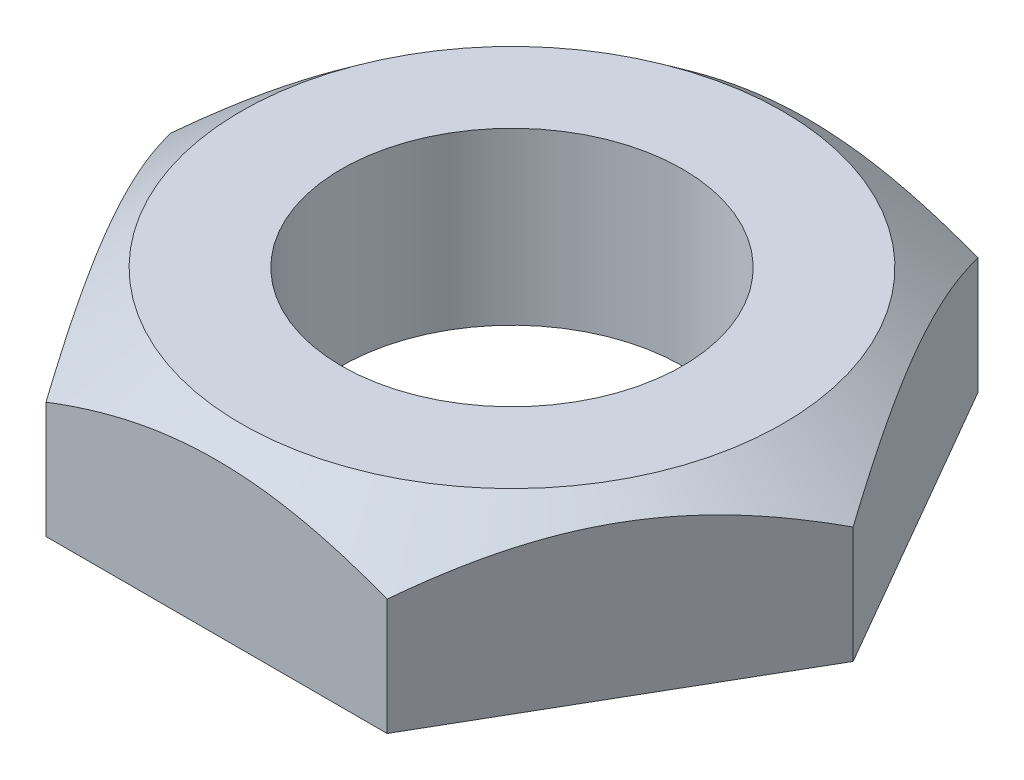
ISO-10303-21;
HEADER;
FILE_DESCRIPTION(('STEP AP214'),'2;1');
FILE_NAME('part.step','',(''),(''),'','','');
FILE_SCHEMA(('AUTOMOTIVE_DESIGN { 1 0 10303 214 1 1 1 1 }'));
ENDSEC;
DATA;
#1=APPLICATION_CONTEXT('core data for automotive mechanical design processes');
#2=APPLICATION_PROTOCOL_DEFINITION('international standard','automotive_design',2000,#1);
#3=PRODUCT_CONTEXT('',#1,'mechanical');
#4=PRODUCT('Part','Part','',(#3));
#5=PRODUCT_RELATED_PRODUCT_CATEGORY('part','',(#4));
#6=PRODUCT_DEFINITION_FORMATION('','',#4);
#7=PRODUCT_DEFINITION_CONTEXT('part definition',#1,'design');
#8=PRODUCT_DEFINITION('design','',#6,#7);
#9=PRODUCT_DEFINITION_SHAPE('','',#8);
#10=(LENGTH_UNIT() NAMED_UNIT(*) SI_UNIT(.MILLI.,.METRE.));
#11=(NAMED_UNIT(*) PLANE_ANGLE_UNIT() SI_UNIT($,.RADIAN.));
#12=(NAMED_UNIT(*) SI_UNIT($,.STERADIAN.) SOLID_ANGLE_UNIT());
#13=UNCERTAINTY_MEASURE_WITH_UNIT(LENGTH_MEASURE(1.E-05),#10,'distance_accuracy_value','');
#14=(GEOMETRIC_REPRESENTATION_CONTEXT(3) GLOBAL_UNCERTAINTY_ASSIGNED_CONTEXT((#13)) GLOBAL_UNIT_ASSIGNED_CONTEXT((#10,
#11,#12)) REPRESENTATION_CONTEXT('',''));
#15=CARTESIAN_POINT('',(0.,0.,0.));
#16=DIRECTION('',(0.,0.,1.));
#17=DIRECTION('',(1.,0.,0.));
#18=AXIS2_PLACEMENT_3D('',#15,#16,#17);
#19=CARTESIAN_POINT('',(0.,15.,0.));
#20=DIRECTION('',(0.,1.,0.));
#21=DIRECTION('',(0.,0.,1.));
#22=AXIS2_PLACEMENT_3D('',#19,#20,#21);
#23=PLANE('',#22);
#24=CARTESIAN_POINT('',(0.,15.,0.));
#25=DIRECTION('',(0.,1.,0.));
#26=DIRECTION('',(0.,0.,1.));
#27=AXIS2_PLACEMENT_3D('',#24,#25,#26);
#28=CIRCLE('',#27,15.);
#29=CARTESIAN_POINT('',(0.,15.,15.));
#30=VERTEX_POINT('',#29);
#31=EDGE_CURVE('E161',#30,#30,#28,.T.);
#32=ORIENTED_EDGE('',*,*,#31,.F.);
#33=EDGE_LOOP('',(#32));
#34=FACE_BOUND('',#33,.T.);
#35=CARTESIAN_POINT('',(0.,15.,0.));
#36=DIRECTION('',(0.,-1.,0.));
#37=DIRECTION('',(0.,0.,-1.));
#38=AXIS2_PLACEMENT_3D('',#35,#36,#37);
#39=CIRCLE('',#38,23.8137384173545);
#40=CARTESIAN_POINT('',(0.,15.,-23.8137384173545));
#41=VERTEX_POINT('',#40);
#42=EDGE_CURVE('E241',#41,#41,#39,.T.);
#43=ORIENTED_EDGE('',*,*,#42,.F.);
#44=EDGE_LOOP('',(#43));
#45=FACE_BOUND('',#44,.T.);
#46=ADVANCED_FACE('F43',(#34,#45),#23,.T.);
#47=CARTESIAN_POINT('',(15.,15.,25.9807621135332));
#48=DIRECTION('',(-0.866025403784439,0.,-0.5));
#49=DIRECTION('',(-0.5,0.,0.866025403784439));
#50=AXIS2_PLACEMENT_3D('',#47,#48,#49);
#51=PLANE('',#50);
#52=CARTESIAN_POINT('',(14.9998845299462,10.2357936435378,25.9809621135332));
#53=CARTESIAN_POINT('',(15.2704859501592,10.4441675611058,25.5122667051238));
#54=CARTESIAN_POINT('',(15.5425280106104,10.6452361831974,25.0410760346268));
#55=CARTESIAN_POINT('',(16.0896323623025,11.0307842811541,24.0934635004539));
#56=CARTESIAN_POINT('',(16.3646956335806,11.2152581842225,23.6170399393041));
#57=CARTESIAN_POINT('',(16.9186460391594,11.5660316287694,22.6575696919683));
#58=CARTESIAN_POINT('',(17.1975422945631,11.7322738684479,22.1745072075684));
#59=CARTESIAN_POINT('',(17.7582460420058,12.0436841397442,21.2033398290034));
#60=CARTESIAN_POINT('',(18.0400532637849,12.1888541092468,20.715235402942));
#61=CARTESIAN_POINT('',(18.6037577371206,12.4546128748615,19.7388706146709));
#62=CARTESIAN_POINT('',(18.8856290360655,12.5754207397537,19.2506552037028));
#63=CARTESIAN_POINT('',(19.4517815987411,12.7920290161786,18.2700502003134));
#64=CARTESIAN_POINT('',(19.7360628953027,12.8878290864671,17.7776605510271));
#65=CARTESIAN_POINT('',(20.3062406784641,13.0524262677183,16.7900836612446));
#66=CARTESIAN_POINT('',(20.5921348451967,13.1212553206842,16.2949004388762));
#67=CARTESIAN_POINT('',(21.1652803085985,13.2305820688845,15.3021833761367));
#68=CARTESIAN_POINT('',(21.452531592742,13.271080025093,14.8046495574608));
#69=CARTESIAN_POINT('',(22.0319119824329,13.3231899697229,13.8011332856071));
#70=CARTESIAN_POINT('',(22.3240508921791,13.3343700419419,13.2951338510587));
#71=CARTESIAN_POINT('',(22.9082246706125,13.3263266528391,12.2833151863627));
#72=CARTESIAN_POINT('',(23.2002595386214,13.3071029968625,11.7774959573895));
#73=CARTESIAN_POINT('',(23.7835965426133,13.2387022750776,10.7671266285407));
#74=CARTESIAN_POINT('',(24.0748982219566,13.1895097354574,10.2625773195878));
#75=CARTESIAN_POINT('',(24.655913525629,13.0623106726729,9.25622929365224));
#76=CARTESIAN_POINT('',(24.9456271447436,12.9843040549549,8.75443058570105));
#77=CARTESIAN_POINT('',(25.5228401677539,12.8011899799362,7.75466830305673));
#78=CARTESIAN_POINT('',(25.8103399754169,12.6960875911595,7.25670402901815));
#79=CARTESIAN_POINT('',(26.3827433164498,12.4608511332335,6.26527235992711));
#80=CARTESIAN_POINT('',(26.6676467950265,12.3307165370788,5.77180505977899));
#81=CARTESIAN_POINT('',(27.5178825828808,11.9062232977044,4.29915347680212));
#82=CARTESIAN_POINT('',(28.0790162169955,11.5776836401266,3.32724151267965));
#83=CARTESIAN_POINT('',(28.8639577073434,11.0614786349708,1.96768297042831));
#84=CARTESIAN_POINT('',(29.0929270530625,10.9039431879406,1.57109643026695));
#85=CARTESIAN_POINT('',(29.5482857071618,10.5778854751727,0.782392105700877));
#86=CARTESIAN_POINT('',(29.7746798805903,10.4093904204214,0.390265894785079));
#87=CARTESIAN_POINT('',(30.0001154700538,10.2357936435378,-0.000200000000009223));
#88=B_SPLINE_CURVE_WITH_KNOTS('',3,(#52,#53,#54,#55,#56,#57,#58,#59,#60,#61,#62,#63,#64,#65,#66,
#67,#68,#69,#70,#71,#72,#73,#74,#75,#76,#77,#78,#79,#80,#81,#82,#83,#84,#85,#86,#87),
.UNSPECIFIED.,.F.,.F.,(4,2,2,2,2,2,2,2,2,2,2,2,2,2,2,2,2,4),(0.,1.73983580816927,
3.4802537193459,5.22599378518515,6.97157320437406,8.70067762095474,10.429805630816,
12.1568795854982,13.8839376308947,15.6362996610812,17.388672910515,19.1419517293121,
20.8952363015643,22.6481931427846,24.4011868932106,27.9055010349313,29.35825415591,
30.8075286844148),.UNSPECIFIED.);
#89=CARTESIAN_POINT('',(15.,10.2358825689841,25.9807621135332));
#90=VERTEX_POINT('',#89);
#91=CARTESIAN_POINT('',(30.,10.2358825689841,0.));
#92=VERTEX_POINT('',#91);
#93=EDGE_CURVE('E108',#90,#92,#88,.T.);
#94=ORIENTED_EDGE('',*,*,#93,.F.);
#95=DIRECTION('',(0.,-1.,0.));
#96=VECTOR('',#95,1.);
#97=CARTESIAN_POINT('',(15.,15.,25.9807621135332));
#98=LINE('',#97,#96);
#99=CARTESIAN_POINT('',(15.,0.,25.9807621135332));
#100=VERTEX_POINT('',#99);
#101=EDGE_CURVE('E73',#90,#100,#98,.T.);
#102=ORIENTED_EDGE('',*,*,#101,.T.);
#103=DIRECTION('',(0.5,0.,-0.866025403784439));
#104=VECTOR('',#103,1.);
#105=CARTESIAN_POINT('',(15.,0.,25.9807621135332));
#106=LINE('',#105,#104);
#107=CARTESIAN_POINT('',(30.,0.,0.));
#108=VERTEX_POINT('',#107);
#109=EDGE_CURVE('E158',#100,#108,#106,.T.);
#110=ORIENTED_EDGE('',*,*,#109,.T.);
#111=DIRECTION('',(0.,-1.,0.));
#112=VECTOR('',#111,1.);
#113=CARTESIAN_POINT('',(30.,15.,0.));
#114=LINE('',#113,#112);
#115=EDGE_CURVE('E59',#92,#108,#114,.T.);
#116=ORIENTED_EDGE('',*,*,#115,.F.);
#117=EDGE_LOOP('',(#94,#102,#110,#116));
#118=FACE_BOUND('',#117,.T.);
#119=ADVANCED_FACE('F45',(#118),#51,.F.);
#120=CARTESIAN_POINT('',(30.,15.,0.));
#121=DIRECTION('',(-0.866025403784439,0.,0.5));
#122=DIRECTION('',(0.5,0.,0.866025403784439));
#123=AXIS2_PLACEMENT_3D('',#120,#121,#122);
#124=PLANE('',#123);
#125=CARTESIAN_POINT('',(30.0001154700538,10.2357936435378,0.000199999999996184));
#126=CARTESIAN_POINT('',(29.7295140498408,10.4441675611059,-0.468495408409326));
#127=CARTESIAN_POINT('',(29.4574719893896,10.6452361831974,-0.939686078906406));
#128=CARTESIAN_POINT('',(28.9103676376975,11.0307842811541,-1.88729861307931));
#129=CARTESIAN_POINT('',(28.6353043664193,11.2152581842225,-2.36372217422908));
#130=CARTESIAN_POINT('',(28.0813539608406,11.5660316287694,-3.32319242156484));
#131=CARTESIAN_POINT('',(27.8024577054369,11.732273868448,-3.80625490596474));
#132=CARTESIAN_POINT('',(27.2417539579942,12.0436841397442,-4.77742228452974));
#133=CARTESIAN_POINT('',(26.959946736215,12.1888541092468,-5.26552671059114));
#134=CARTESIAN_POINT('',(26.3962422628794,12.4546128748615,-6.2418914988623));
#135=CARTESIAN_POINT('',(26.1143709639345,12.5754207397538,-6.73010690983039));
#136=CARTESIAN_POINT('',(25.5482184012589,12.7920290161787,-7.71071191321978));
#137=CARTESIAN_POINT('',(25.2639371046973,12.8878290864671,-8.20310156250604));
#138=CARTESIAN_POINT('',(24.6937593215359,13.0524262677183,-9.19067845228858));
#139=CARTESIAN_POINT('',(24.4078651548033,13.1212553206842,-9.68586167465696));
#140=CARTESIAN_POINT('',(23.8347196914015,13.2305820688845,-10.6785787373965));
#141=CARTESIAN_POINT('',(23.547468407258,13.271080025093,-11.1761125560724));
#142=CARTESIAN_POINT('',(22.9680880175671,13.3231899697229,-12.1796288279261));
#143=CARTESIAN_POINT('',(22.6759491078209,13.334370041942,-12.6856282624744));
#144=CARTESIAN_POINT('',(22.0917753293875,13.3263266528391,-13.6974469271705));
#145=CARTESIAN_POINT('',(21.7997404613785,13.3071029968625,-14.2032661561437));
#146=CARTESIAN_POINT('',(21.2164034573867,13.2387022750776,-15.2136354849925));
#147=CARTESIAN_POINT('',(20.9251017780434,13.1895097354574,-15.7181847939453));
#148=CARTESIAN_POINT('',(20.344086474371,13.0623106726729,-16.7245328198809));
#149=CARTESIAN_POINT('',(20.0543728552564,12.9843040549549,-17.2263315278321));
#150=CARTESIAN_POINT('',(19.477159832246,12.8011899799362,-18.2260938104764));
#151=CARTESIAN_POINT('',(19.1896600245831,12.6960875911595,-18.724058084515));
#152=CARTESIAN_POINT('',(18.6172566835502,12.4608511332335,-19.7154897536061));
#153=CARTESIAN_POINT('',(18.3323532049734,12.3307165370788,-20.2089570537542));
#154=CARTESIAN_POINT('',(17.4821174171192,11.9062232977044,-21.681608636731));
#155=CARTESIAN_POINT('',(16.9209837830045,11.5776836401266,-22.6535206008535));
#156=CARTESIAN_POINT('',(16.1360422926566,11.0614786349708,-24.0130791431049));
#157=CARTESIAN_POINT('',(15.9070729469375,10.9039431879406,-24.4096656832662));
#158=CARTESIAN_POINT('',(15.4517142928382,10.5778854751727,-25.1983700078323));
#159=CARTESIAN_POINT('',(15.2253201194097,10.4093904204214,-25.5904962187481));
#160=CARTESIAN_POINT('',(14.9998845299461,10.2357936435378,-25.9809621135332));
#161=B_SPLINE_CURVE_WITH_KNOTS('',3,(#125,#126,#127,#128,#129,#130,#131,#132,#133,#134,#135,
#136,#137,#138,#139,#140,#141,#142,#143,#144,#145,#146,#147,#148,#149,#150,#151,#152,#153,#154,
#155,#156,#157,#158,#159,#160),.UNSPECIFIED.,.F.,.F.,(4,2,2,2,2,2,2,2,2,2,2,2,2,2,2,2,2,4),(0.,
1.73983580816927,3.4802537193459,5.22599378518515,6.97157320437407,8.70067762095475,
10.429805630816,12.1568795854982,13.8839376308947,15.6362996610812,17.388672910515,
19.1419517293121,20.8952363015643,22.6481931427846,24.4011868932106,27.9055010349313,
29.35825415591,30.8075286844148),.UNSPECIFIED.);
#162=CARTESIAN_POINT('',(15.,10.2358825689841,-25.9807621135332));
#163=VERTEX_POINT('',#162);
#164=EDGE_CURVE('E103',#92,#163,#161,.T.);
#165=ORIENTED_EDGE('',*,*,#164,.F.);
#166=ORIENTED_EDGE('',*,*,#115,.T.);
#167=DIRECTION('',(-0.5,0.,-0.866025403784439));
#168=VECTOR('',#167,1.);
#169=CARTESIAN_POINT('',(30.,0.,0.));
#170=LINE('',#169,#168);
#171=CARTESIAN_POINT('',(15.,0.,-25.9807621135332));
#172=VERTEX_POINT('',#171);
#173=EDGE_CURVE('E126',#108,#172,#170,.T.);
#174=ORIENTED_EDGE('',*,*,#173,.T.);
#175=DIRECTION('',(0.,-1.,0.));
#176=VECTOR('',#175,1.);
#177=CARTESIAN_POINT('',(15.,15.,-25.9807621135332));
#178=LINE('',#177,#176);
#179=EDGE_CURVE('E118',#163,#172,#178,.T.);
#180=ORIENTED_EDGE('',*,*,#179,.F.);
#181=EDGE_LOOP('',(#165,#166,#174,#180));
#182=FACE_BOUND('',#181,.T.);
#183=ADVANCED_FACE('F124',(#182),#124,.F.);
#184=CARTESIAN_POINT('',(15.,15.,-25.9807621135332));
#185=DIRECTION('',(0.,0.,1.));
#186=DIRECTION('',(1.,0.,0.));
#187=AXIS2_PLACEMENT_3D('',#184,#185,#186);
#188=PLANE('',#187);
#189=CARTESIAN_POINT('',(45.376124922486,-6.92807404338308,-25.9807621135332));
#190=CARTESIAN_POINT('',(44.5449377185835,-6.37261734748064,-25.9807621135332));
#191=CARTESIAN_POINT('',(43.7120388931108,-5.81970710763573,-25.9807621135332));
#192=CARTESIAN_POINT('',(42.0422445945186,-4.71989951347316,-25.9807621135332));
#193=CARTESIAN_POINT('',(41.2053489959251,-4.17300234973302,-25.9807621135332));
#194=CARTESIAN_POINT('',(39.5263788348697,-3.08574781745709,-25.9807621135332));
#195=CARTESIAN_POINT('',(38.684300710475,-2.54539594297445,-25.9807621135332));
#196=CARTESIAN_POINT('',(36.9949532335773,-1.47287592031365,-25.9807621135332));
#197=CARTESIAN_POINT('',(36.1476839233394,-0.940707705630053,-25.9807621135332));
#198=CARTESIAN_POINT('',(34.4222449850435,0.129440771681268,-25.9807621135332));
#199=CARTESIAN_POINT('',(33.5438973535747,0.66713446125507,-25.9807621135332));
#200=CARTESIAN_POINT('',(31.7798263007849,1.73033009285057,-25.9807621135332));
#201=CARTESIAN_POINT('',(30.8941027934177,2.25583189237116,-25.9807621135332));
#202=CARTESIAN_POINT('',(29.1143223661898,3.29199351072169,-25.9807621135332));
#203=CARTESIAN_POINT('',(28.2202677808193,3.80265733144407,-25.9807621135332));
#204=CARTESIAN_POINT('',(26.4221809328339,4.80612116331534,-25.9807621135332));
#205=CARTESIAN_POINT('',(25.5181489256437,5.29892163039364,-25.9807621135332));
#206=CARTESIAN_POINT('',(23.9245504921419,6.14285697259477,-25.9807621135332));
#207=CARTESIAN_POINT('',(23.2375139544625,6.49876483624686,-25.9807621135332));
#208=CARTESIAN_POINT('',(21.856084784585,7.1960513708593,-25.9807621135332));
#209=CARTESIAN_POINT('',(21.1616921450369,7.53743002730072,-25.9807621135332));
#210=CARTESIAN_POINT('',(19.7644655669596,8.20321997542664,-25.9807621135332));
#211=CARTESIAN_POINT('',(19.0616284734025,8.52762466652126,-25.9807621135332));
#212=CARTESIAN_POINT('',(17.6469504778696,9.15624016996916,-25.9807621135332));
#213=CARTESIAN_POINT('',(16.9351096353771,9.46045111564957,-25.9807621135332));
#214=CARTESIAN_POINT('',(15.5084234427492,10.0422595376663,-25.9807621135332));
#215=CARTESIAN_POINT('',(14.7936699306249,10.3200811875424,-25.9807621135332));
#216=CARTESIAN_POINT('',(13.3539666960497,10.8481769076638,-25.9807621135332));
#217=CARTESIAN_POINT('',(12.6290166009468,11.0984499681319,-25.9807621135332));
#218=CARTESIAN_POINT('',(11.1691952147574,11.5665701215559,-25.9807621135332));
#219=CARTESIAN_POINT('',(10.4343309024642,11.7844388457154,-25.9807621135332));
#220=CARTESIAN_POINT('',(8.9545472435966,12.1828247970844,-25.9807621135332));
#221=CARTESIAN_POINT('',(8.20962944534514,12.3633477074957,-25.9807621135332));
#222=CARTESIAN_POINT('',(6.94413383956382,12.6323253280947,-25.9807621135332));
#223=CARTESIAN_POINT('',(6.42591800398296,12.7319458981922,-25.9807621135332));
#224=CARTESIAN_POINT('',(5.38579669746268,12.9094961028935,-25.9807621135332));
#225=CARTESIAN_POINT('',(4.86389152265968,12.9874274586259,-25.9807621135332));
#226=CARTESIAN_POINT('',(3.8172237783469,13.1202502447026,-25.9807621135332));
#227=CARTESIAN_POINT('',(3.29246164779128,13.175145118606,-25.9807621135332));
#228=CARTESIAN_POINT('',(2.24096109113732,13.2608927658515,-25.9807621135332));
#229=CARTESIAN_POINT('',(1.71422265141634,13.2917453731639,-25.9807621135332));
#230=CARTESIAN_POINT('',(0.66077061829569,13.3287732149059,-25.9807621135332));
#231=CARTESIAN_POINT('',(0.134058504124369,13.3349903004756,-25.9807621135332));
#232=CARTESIAN_POINT('',(-0.919070546331632,13.3227392263465,-25.9807621135332));
#233=CARTESIAN_POINT('',(-1.44548748578327,13.3042713367693,-25.9807621135332));
#234=CARTESIAN_POINT('',(-2.49696488002177,13.2430103312549,-25.9807621135332));
#235=CARTESIAN_POINT('',(-3.02202515535958,13.2002141477814,-25.9807621135332));
#236=CARTESIAN_POINT('',(-4.06969606065956,13.09111309196,-25.9807621135332));
#237=CARTESIAN_POINT('',(-4.59230658917837,13.0248072546464,-25.9807621135332));
#238=CARTESIAN_POINT('',(-5.79673875905857,12.8456875874088,-25.9807621135332));
#239=CARTESIAN_POINT('',(-6.47736913792761,12.7248179814397,-25.9807621135332));
#240=CARTESIAN_POINT('',(-7.83144818655453,12.4479751352399,-25.9807621135332));
#241=CARTESIAN_POINT('',(-8.50489607066225,12.2919980952391,-25.9807621135332));
#242=CARTESIAN_POINT('',(-9.84407994537945,11.9486020417369,-25.9807621135332));
#243=CARTESIAN_POINT('',(-10.5098113826956,11.7611653830972,-25.9807621135332));
#244=CARTESIAN_POINT('',(-11.8328151218108,11.3587018956021,-25.9807621135332));
#245=CARTESIAN_POINT('',(-12.4900875751277,11.1436755616934,-25.9807621135332));
#246=CARTESIAN_POINT('',(-13.8049298706135,10.6865932678735,-25.9807621135332));
#247=CARTESIAN_POINT('',(-14.4623874210199,10.4442158721286,-25.9807621135332));
#248=CARTESIAN_POINT('',(-15.7690286680703,9.93818378673192,-25.9807621135332));
#249=CARTESIAN_POINT('',(-16.4182123275415,9.67452900152435,-25.9807621135332));
#250=CARTESIAN_POINT('',(-17.7086099643279,9.12899626110677,-25.9807621135332));
#251=CARTESIAN_POINT('',(-18.3498263636217,8.84712401386535,-25.9807621135332));
#252=CARTESIAN_POINT('',(-19.6251212907933,8.26762635469274,-25.9807621135332));
#253=CARTESIAN_POINT('',(-20.2591994357418,7.97000010248023,-25.9807621135332));
#254=CARTESIAN_POINT('',(-21.4372540575722,7.40150722901005,-25.9807621135332));
#255=CARTESIAN_POINT('',(-21.9820419681508,7.13231681544226,-25.9807621135332));
#256=CARTESIAN_POINT('',(-23.06708538049,6.58494024964515,-25.9807621135332));
#257=CARTESIAN_POINT('',(-23.6073407866952,6.30675390835855,-25.9807621135332));
#258=CARTESIAN_POINT('',(-25.2219528490989,5.46029225400543,-25.9807621135332));
#259=CARTESIAN_POINT('',(-26.2900933053411,4.88014454663575,-25.9807621135332));
#260=CARTESIAN_POINT('',(-28.4131703785786,3.69468597289445,-25.9807621135332));
#261=CARTESIAN_POINT('',(-29.4680976592889,3.08935849059919,-25.9807621135332));
#262=CARTESIAN_POINT('',(-31.5663077083543,1.85898944279796,-25.9807621135332));
#263=CARTESIAN_POINT('',(-32.6095909539576,1.23394868931688,-25.9807621135332));
#264=CARTESIAN_POINT('',(-34.6407067857788,-0.00413106874421333,-25.9807621135332));
#265=CARTESIAN_POINT('',(-35.6289575459989,-0.61648587469477,-25.9807621135332));
#266=CARTESIAN_POINT('',(-37.5979716760499,-1.85313931928723,-25.9807621135332));
#267=CARTESIAN_POINT('',(-38.5787349073358,-2.477438178189,-25.9807621135332));
#268=CARTESIAN_POINT('',(-40.5320672809251,-3.73477416038295,-25.9807621135332));
#269=CARTESIAN_POINT('',(-41.5046482404374,-4.36779294535877,-25.9807621135332));
#270=CARTESIAN_POINT('',(-42.9594063054745,-5.32350965165741,-25.9807621135332));
#271=CARTESIAN_POINT('',(-43.4436264806934,-5.64310419509247,-25.9807621135332));
#272=CARTESIAN_POINT('',(-44.4108005192032,-6.28419944216701,-25.9807621135332));
#273=CARTESIAN_POINT('',(-44.8937543878599,-6.60570013771044,-25.9807621135332));
#274=CARTESIAN_POINT('',(-45.376124922486,-6.92807404338308,-25.9807621135332));
#275=B_SPLINE_CURVE_WITH_KNOTS('',3,(#189,#190,#191,#192,#193,#194,#195,#196,#197,#198,#199,
#200,#201,#202,#203,#204,#205,#206,#207,#208,#209,#210,#211,#212,#213,#214,#215,#216,#217,#218,
#219,#220,#221,#222,#223,#224,#225,#226,#227,#228,#229,#230,#231,#232,#233,#234,#235,#236,#237,
#238,#239,#240,#241,#242,#243,#244,#245,#246,#247,#248,#249,#250,#251,#252,#253,#254,#255,#256,
#257,#258,#259,#260,#261,#262,#263,#264,#265,#266,#267,#268,#269,#270,#271,#272,#273,#274),
.UNSPECIFIED.,.F.,.F.,(4,2,2,2,2,2,2,2,2,2,2,2,2,2,2,2,2,2,2,2,2,2,2,2,2,2,2,2,2,2,2,2,2,2,2,2,
2,2,2,2,2,2,4),(0.,2.99911386872934,5.99832251848741,8.99989499119492,12.0014430583749,
15.0909370716264,18.1804671772943,21.2691561343189,24.3577662026247,26.6788754115617,
28.9999869399148,31.3219944608333,33.6439866494089,35.9440534769601,38.2442045840501,
40.5428132887565,42.8410719386443,44.4237795234107,46.006361477968,47.588706779312,
49.1710630078267,50.7507299538961,52.3303796141964,53.910228495531,55.4901422300711,
57.5629145424925,59.6359113044866,61.7100746827833,63.7842008566939,65.8859107495365,
67.9876300815832,70.0886940573247,72.189870211991,74.0127753320384,75.8357187869578,
79.4818126652513,83.130351973576,86.7787411878242,90.266415042502,93.7541532753625,
97.2354278727289,98.9759668604745,100.716498460876),.UNSPECIFIED.);
#276=CARTESIAN_POINT('',(-15.,10.2358825689841,-25.9807621135332));
#277=VERTEX_POINT('',#276);
#278=EDGE_CURVE('E106',#163,#277,#275,.T.);
#279=ORIENTED_EDGE('',*,*,#278,.F.);
#280=ORIENTED_EDGE('',*,*,#179,.T.);
#281=DIRECTION('',(-1.,0.,0.));
#282=VECTOR('',#281,1.);
#283=CARTESIAN_POINT('',(15.,0.,-25.9807621135332));
#284=LINE('',#283,#282);
#285=CARTESIAN_POINT('',(-15.,0.,-25.9807621135332));
#286=VERTEX_POINT('',#285);
#287=EDGE_CURVE('E153',#172,#286,#284,.T.);
#288=ORIENTED_EDGE('',*,*,#287,.T.);
#289=DIRECTION('',(0.,-1.,0.));
#290=VECTOR('',#289,1.);
#291=CARTESIAN_POINT('',(-15.,15.,-25.9807621135332));
#292=LINE('',#291,#290);
#293=EDGE_CURVE('E120',#277,#286,#292,.T.);
#294=ORIENTED_EDGE('',*,*,#293,.F.);
#295=EDGE_LOOP('',(#279,#280,#288,#294));
#296=FACE_BOUND('',#295,.T.);
#297=ADVANCED_FACE('F116',(#296),#188,.F.);
#298=CARTESIAN_POINT('',(-15.,15.,-25.9807621135332));
#299=DIRECTION('',(0.866025403784439,0.,0.5));
#300=DIRECTION('',(0.5,0.,-0.866025403784439));
#301=AXIS2_PLACEMENT_3D('',#298,#299,#300);
#302=PLANE('',#301);
#303=CARTESIAN_POINT('',(-14.9998845299462,10.2357936435378,-25.9809621135332));
#304=CARTESIAN_POINT('',(-15.2704859501592,10.4441675611058,-25.5122667051238));
#305=CARTESIAN_POINT('',(-15.5425280106104,10.6452361831974,-25.0410760346268));
#306=CARTESIAN_POINT('',(-16.0896323623025,11.0307842811541,-24.0934635004539));
#307=CARTESIAN_POINT('',(-16.3646956335806,11.2152581842225,-23.6170399393041));
#308=CARTESIAN_POINT('',(-16.9186460391594,11.5660316287694,-22.6575696919683));
#309=CARTESIAN_POINT('',(-17.1975422945631,11.732273868448,-22.1745072075684));
#310=CARTESIAN_POINT('',(-17.7582460420058,12.0436841397442,-21.2033398290034));
#311=CARTESIAN_POINT('',(-18.040053263785,12.1888541092468,-20.715235402942));
#312=CARTESIAN_POINT('',(-18.6037577371206,12.4546128748615,-19.7388706146709));
#313=CARTESIAN_POINT('',(-18.8856290360655,12.5754207397537,-19.2506552037028));
#314=CARTESIAN_POINT('',(-19.4517815987411,12.7920290161786,-18.2700502003134));
#315=CARTESIAN_POINT('',(-19.7360628953027,12.8878290864671,-17.7776605510271));
#316=CARTESIAN_POINT('',(-20.3062406784641,13.0524262677183,-16.7900836612446));
#317=CARTESIAN_POINT('',(-20.5921348451967,13.1212553206842,-16.2949004388762));
#318=CARTESIAN_POINT('',(-21.1652803085985,13.2305820688845,-15.3021833761367));
#319=CARTESIAN_POINT('',(-21.452531592742,13.271080025093,-14.8046495574608));
#320=CARTESIAN_POINT('',(-22.0319119824329,13.3231899697229,-13.8011332856071));
#321=CARTESIAN_POINT('',(-22.3240508921791,13.3343700419419,-13.2951338510587));
#322=CARTESIAN_POINT('',(-22.9082246706125,13.3263266528391,-12.2833151863627));
#323=CARTESIAN_POINT('',(-23.2002595386214,13.3071029968625,-11.7774959573895));
#324=CARTESIAN_POINT('',(-23.7835965426133,13.2387022750776,-10.7671266285407));
#325=CARTESIAN_POINT('',(-24.0748982219566,13.1895097354574,-10.2625773195878));
#326=CARTESIAN_POINT('',(-24.655913525629,13.0623106726729,-9.25622929365223));
#327=CARTESIAN_POINT('',(-24.9456271447436,12.9843040549549,-8.75443058570105));
#328=CARTESIAN_POINT('',(-25.5228401677539,12.8011899799362,-7.75466830305673));
#329=CARTESIAN_POINT('',(-25.8103399754169,12.6960875911595,-7.25670402901815));
#330=CARTESIAN_POINT('',(-26.3827433164498,12.4608511332335,-6.26527235992711));
#331=CARTESIAN_POINT('',(-26.6676467950266,12.3307165370788,-5.771805059779));
#332=CARTESIAN_POINT('',(-27.5178825828808,11.9062232977044,-4.29915347680213));
#333=CARTESIAN_POINT('',(-28.0790162169955,11.5776836401266,-3.32724151267965));
#334=CARTESIAN_POINT('',(-28.8639577073434,11.0614786349708,-1.96768297042831));
#335=CARTESIAN_POINT('',(-29.0929270530625,10.9039431879406,-1.57109643026695));
#336=CARTESIAN_POINT('',(-29.5482857071618,10.5778854751727,-0.782392105700879));
#337=CARTESIAN_POINT('',(-29.7746798805903,10.4093904204214,-0.39026589478508));
#338=CARTESIAN_POINT('',(-30.0001154700538,10.2357936435378,0.000200000000006085));
#339=B_SPLINE_CURVE_WITH_KNOTS('',3,(#303,#304,#305,#306,#307,#308,#309,#310,#311,#312,#313,
#314,#315,#316,#317,#318,#319,#320,#321,#322,#323,#324,#325,#326,#327,#328,#329,#330,#331,#332,
#333,#334,#335,#336,#337,#338),.UNSPECIFIED.,.F.,.F.,(4,2,2,2,2,2,2,2,2,2,2,2,2,2,2,2,2,4),(0.,
1.73983580816927,3.4802537193459,5.22599378518515,6.97157320437407,8.70067762095475,
10.429805630816,12.1568795854982,13.8839376308947,15.6362996610812,17.388672910515,
19.1419517293121,20.8952363015643,22.6481931427846,24.4011868932106,27.9055010349313,
29.35825415591,30.8075286844148),.UNSPECIFIED.);
#340=CARTESIAN_POINT('',(-30.,10.2358825689841,0.));
#341=VERTEX_POINT('',#340);
#342=EDGE_CURVE('E122',#277,#341,#339,.T.);
#343=ORIENTED_EDGE('',*,*,#342,.F.);
#344=ORIENTED_EDGE('',*,*,#293,.T.);
#345=DIRECTION('',(-0.5,0.,0.866025403784439));
#346=VECTOR('',#345,1.);
#347=CARTESIAN_POINT('',(-15.,0.,-25.9807621135332));
#348=LINE('',#347,#346);
#349=CARTESIAN_POINT('',(-30.,0.,0.));
#350=VERTEX_POINT('',#349);
#351=EDGE_CURVE('E149',#286,#350,#348,.T.);
#352=ORIENTED_EDGE('',*,*,#351,.T.);
#353=DIRECTION('',(0.,-1.,0.));
#354=VECTOR('',#353,1.);
#355=CARTESIAN_POINT('',(-30.,15.,0.));
#356=LINE('',#355,#354);
#357=EDGE_CURVE('E132',#341,#350,#356,.T.);
#358=ORIENTED_EDGE('',*,*,#357,.F.);
#359=EDGE_LOOP('',(#343,#344,#352,#358));
#360=FACE_BOUND('',#359,.T.);
#361=ADVANCED_FACE('F209',(#360),#302,.F.);
#362=CARTESIAN_POINT('',(-30.,15.,0.));
#363=DIRECTION('',(0.866025403784439,0.,-0.5));
#364=DIRECTION('',(-0.5,0.,-0.866025403784439));
#365=AXIS2_PLACEMENT_3D('',#362,#363,#364);
#366=PLANE('',#365);
#367=CARTESIAN_POINT('',(-30.0001154700538,10.2357936435378,-0.000199999999999653));
#368=CARTESIAN_POINT('',(-29.7295140498408,10.4441675611058,0.468495408409323));
#369=CARTESIAN_POINT('',(-29.4574719893896,10.6452361831974,0.939686078906403));
#370=CARTESIAN_POINT('',(-28.9103676376975,11.0307842811541,1.88729861307931));
#371=CARTESIAN_POINT('',(-28.6353043664194,11.2152581842225,2.36372217422908));
#372=CARTESIAN_POINT('',(-28.0813539608406,11.5660316287694,3.32319242156484));
#373=CARTESIAN_POINT('',(-27.8024577054369,11.732273868448,3.80625490596474));
#374=CARTESIAN_POINT('',(-27.2417539579942,12.0436841397442,4.77742228452974));
#375=CARTESIAN_POINT('',(-26.959946736215,12.1888541092468,5.26552671059113));
#376=CARTESIAN_POINT('',(-26.3962422628794,12.4546128748615,6.2418914988623));
#377=CARTESIAN_POINT('',(-26.1143709639345,12.5754207397537,6.73010690983039));
#378=CARTESIAN_POINT('',(-25.5482184012589,12.7920290161786,7.71071191321978));
#379=CARTESIAN_POINT('',(-25.2639371046973,12.8878290864671,8.20310156250604));
#380=CARTESIAN_POINT('',(-24.6937593215359,13.0524262677183,9.19067845228858));
#381=CARTESIAN_POINT('',(-24.4078651548033,13.1212553206842,9.68586167465696));
#382=CARTESIAN_POINT('',(-23.8347196914015,13.2305820688845,10.6785787373965));
#383=CARTESIAN_POINT('',(-23.547468407258,13.271080025093,11.1761125560724));
#384=CARTESIAN_POINT('',(-22.9680880175671,13.3231899697229,12.1796288279261));
#385=CARTESIAN_POINT('',(-22.6759491078209,13.3343700419419,12.6856282624744));
#386=CARTESIAN_POINT('',(-22.0917753293875,13.3263266528391,13.6974469271705));
#387=CARTESIAN_POINT('',(-21.7997404613786,13.3071029968625,14.2032661561437));
#388=CARTESIAN_POINT('',(-21.2164034573867,13.2387022750776,15.2136354849925));
#389=CARTESIAN_POINT('',(-20.9251017780434,13.1895097354574,15.7181847939453));
#390=CARTESIAN_POINT('',(-20.344086474371,13.0623106726729,16.7245328198809));
#391=CARTESIAN_POINT('',(-20.0543728552564,12.9843040549549,17.2263315278321));
#392=CARTESIAN_POINT('',(-19.4771598322461,12.8011899799362,18.2260938104764));
#393=CARTESIAN_POINT('',(-19.1896600245831,12.6960875911595,18.724058084515));
#394=CARTESIAN_POINT('',(-18.6172566835502,12.4608511332335,19.7154897536061));
#395=CARTESIAN_POINT('',(-18.3323532049734,12.3307165370788,20.2089570537542));
#396=CARTESIAN_POINT('',(-17.4821174171192,11.9062232977044,21.681608636731));
#397=CARTESIAN_POINT('',(-16.9209837830045,11.5776836401266,22.6535206008535));
#398=CARTESIAN_POINT('',(-16.1360422926566,11.0614786349708,24.0130791431049));
#399=CARTESIAN_POINT('',(-15.9070729469375,10.9039431879406,24.4096656832662));
#400=CARTESIAN_POINT('',(-15.4517142928382,10.5778854751727,25.1983700078323));
#401=CARTESIAN_POINT('',(-15.2253201194097,10.4093904204214,25.5904962187481));
#402=CARTESIAN_POINT('',(-14.9998845299462,10.2357936435378,25.9809621135332));
#403=B_SPLINE_CURVE_WITH_KNOTS('',3,(#367,#368,#369,#370,#371,#372,#373,#374,#375,#376,#377,
#378,#379,#380,#381,#382,#383,#384,#385,#386,#387,#388,#389,#390,#391,#392,#393,#394,#395,#396,
#397,#398,#399,#400,#401,#402),.UNSPECIFIED.,.F.,.F.,(4,2,2,2,2,2,2,2,2,2,2,2,2,2,2,2,2,4),(0.,
1.73983580816927,3.4802537193459,5.22599378518515,6.97157320437407,8.70067762095475,
10.429805630816,12.1568795854982,13.8839376308947,15.6362996610812,17.388672910515,
19.1419517293121,20.8952363015643,22.6481931427846,24.4011868932106,27.9055010349313,
29.35825415591,30.8075286844148),.UNSPECIFIED.);
#404=CARTESIAN_POINT('',(-15.,10.2358825689841,25.9807621135332));
#405=VERTEX_POINT('',#404);
#406=EDGE_CURVE('E65',#341,#405,#403,.T.);
#407=ORIENTED_EDGE('',*,*,#406,.F.);
#408=ORIENTED_EDGE('',*,*,#357,.T.);
#409=DIRECTION('',(0.5,0.,0.866025403784439));
#410=VECTOR('',#409,1.);
#411=CARTESIAN_POINT('',(-30.,0.,0.));
#412=LINE('',#411,#410);
#413=CARTESIAN_POINT('',(-15.,0.,25.9807621135332));
#414=VERTEX_POINT('',#413);
#415=EDGE_CURVE('E145',#350,#414,#412,.T.);
#416=ORIENTED_EDGE('',*,*,#415,.T.);
#417=DIRECTION('',(0.,-1.,0.));
#418=VECTOR('',#417,1.);
#419=CARTESIAN_POINT('',(-15.,15.,25.9807621135332));
#420=LINE('',#419,#418);
#421=EDGE_CURVE('E137',#405,#414,#420,.T.);
#422=ORIENTED_EDGE('',*,*,#421,.F.);
#423=EDGE_LOOP('',(#407,#408,#416,#422));
#424=FACE_BOUND('',#423,.T.);
#425=ADVANCED_FACE('F229',(#424),#366,.F.);
#426=CARTESIAN_POINT('',(-15.,15.,25.9807621135332));
#427=DIRECTION('',(0.,0.,-1.));
#428=DIRECTION('',(-1.,0.,0.));
#429=AXIS2_PLACEMENT_3D('',#426,#427,#428);
#430=PLANE('',#429);
#431=CARTESIAN_POINT('',(-45.376124922486,-6.92807404338309,25.9807621135332));
#432=CARTESIAN_POINT('',(-44.5449377185835,-6.37261734748065,25.9807621135332));
#433=CARTESIAN_POINT('',(-43.7120388931108,-5.81970710763574,25.9807621135332));
#434=CARTESIAN_POINT('',(-42.0422445945187,-4.71989951347317,25.9807621135332));
#435=CARTESIAN_POINT('',(-41.2053489959251,-4.17300234973303,25.9807621135332));
#436=CARTESIAN_POINT('',(-39.5263788348697,-3.0857478174571,25.9807621135332));
#437=CARTESIAN_POINT('',(-38.684300710475,-2.54539594297445,25.9807621135332));
#438=CARTESIAN_POINT('',(-36.9949532335773,-1.47287592031366,25.9807621135332));
#439=CARTESIAN_POINT('',(-36.1476839233394,-0.940707705630064,25.9807621135332));
#440=CARTESIAN_POINT('',(-34.4222449850435,0.129440771681257,25.9807621135332));
#441=CARTESIAN_POINT('',(-33.5438973535747,0.667134461255062,25.9807621135332));
#442=CARTESIAN_POINT('',(-31.779826300785,1.73033009285057,25.9807621135332));
#443=CARTESIAN_POINT('',(-30.8941027934177,2.25583189237115,25.9807621135332));
#444=CARTESIAN_POINT('',(-29.1143223661898,3.29199351072168,25.9807621135332));
#445=CARTESIAN_POINT('',(-28.2202677808193,3.80265733144406,25.9807621135332));
#446=CARTESIAN_POINT('',(-26.4221809328339,4.80612116331533,25.9807621135332));
#447=CARTESIAN_POINT('',(-25.5181489256437,5.29892163039363,25.9807621135332));
#448=CARTESIAN_POINT('',(-23.9245504921419,6.14285697259477,25.9807621135332));
#449=CARTESIAN_POINT('',(-23.2375139544625,6.49876483624685,25.9807621135332));
#450=CARTESIAN_POINT('',(-21.856084784585,7.19605137085929,25.9807621135332));
#451=CARTESIAN_POINT('',(-21.161692145037,7.5374300273007,25.9807621135332));
#452=CARTESIAN_POINT('',(-19.7644655669597,8.20321997542663,25.9807621135332));
#453=CARTESIAN_POINT('',(-19.0616284734025,8.52762466652126,25.9807621135332));
#454=CARTESIAN_POINT('',(-17.6469504778696,9.15624016996915,25.9807621135332));
#455=CARTESIAN_POINT('',(-16.9351096353771,9.46045111564956,25.9807621135332));
#456=CARTESIAN_POINT('',(-15.5084234427492,10.0422595376663,25.9807621135332));
#457=CARTESIAN_POINT('',(-14.7936699306249,10.3200811875424,25.9807621135332));
#458=CARTESIAN_POINT('',(-13.3539666960497,10.8481769076638,25.9807621135332));
#459=CARTESIAN_POINT('',(-12.6290166009468,11.0984499681319,25.9807621135332));
#460=CARTESIAN_POINT('',(-11.1691952147574,11.5665701215559,25.9807621135332));
#461=CARTESIAN_POINT('',(-10.4343309024642,11.7844388457154,25.9807621135332));
#462=CARTESIAN_POINT('',(-8.95454724359662,12.1828247970844,25.9807621135332));
#463=CARTESIAN_POINT('',(-8.20962944534516,12.3633477074956,25.9807621135332));
#464=CARTESIAN_POINT('',(-6.94413383956384,12.6323253280946,25.9807621135332));
#465=CARTESIAN_POINT('',(-6.42591800398298,12.7319458981922,25.9807621135332));
#466=CARTESIAN_POINT('',(-5.3857966974627,12.9094961028935,25.9807621135332));
#467=CARTESIAN_POINT('',(-4.8638915226597,12.9874274586259,25.9807621135332));
#468=CARTESIAN_POINT('',(-3.81722377834692,13.1202502447026,25.9807621135332));
#469=CARTESIAN_POINT('',(-3.29246164779129,13.175145118606,25.9807621135332));
#470=CARTESIAN_POINT('',(-2.24096109113733,13.2608927658515,25.9807621135332));
#471=CARTESIAN_POINT('',(-1.71422265141636,13.2917453731639,25.9807621135332));
#472=CARTESIAN_POINT('',(-0.660770618295703,13.3287732149059,25.9807621135332));
#473=CARTESIAN_POINT('',(-0.134058504124379,13.3349903004756,25.9807621135332));
#474=CARTESIAN_POINT('',(0.919070546331621,13.3227392263465,25.9807621135332));
#475=CARTESIAN_POINT('',(1.44548748578326,13.3042713367693,25.9807621135332));
#476=CARTESIAN_POINT('',(2.49696488002175,13.2430103312549,25.9807621135332));
#477=CARTESIAN_POINT('',(3.02202515535956,13.2002141477814,25.9807621135332));
#478=CARTESIAN_POINT('',(4.06969606065954,13.09111309196,25.9807621135332));
#479=CARTESIAN_POINT('',(4.59230658917835,13.0248072546464,25.9807621135332));
#480=CARTESIAN_POINT('',(5.79673875905855,12.8456875874088,25.9807621135332));
#481=CARTESIAN_POINT('',(6.47736913792759,12.7248179814397,25.9807621135332));
#482=CARTESIAN_POINT('',(7.8314481865545,12.4479751352399,25.9807621135332));
#483=CARTESIAN_POINT('',(8.50489607066222,12.2919980952391,25.9807621135332));
#484=CARTESIAN_POINT('',(9.84407994537943,11.9486020417369,25.9807621135332));
#485=CARTESIAN_POINT('',(10.5098113826956,11.7611653830972,25.9807621135332));
#486=CARTESIAN_POINT('',(11.8328151218108,11.3587018956021,25.9807621135332));
#487=CARTESIAN_POINT('',(12.4900875751277,11.1436755616934,25.9807621135332));
#488=CARTESIAN_POINT('',(13.8049298706134,10.6865932678735,25.9807621135332));
#489=CARTESIAN_POINT('',(14.4623874210199,10.4442158721286,25.9807621135332));
#490=CARTESIAN_POINT('',(15.7690286680703,9.93818378673193,25.9807621135332));
#491=CARTESIAN_POINT('',(16.4182123275415,9.67452900152435,25.9807621135332));
#492=CARTESIAN_POINT('',(17.7086099643279,9.12899626110677,25.9807621135332));
#493=CARTESIAN_POINT('',(18.3498263636217,8.84712401386535,25.9807621135332));
#494=CARTESIAN_POINT('',(19.6251212907933,8.26762635469275,25.9807621135332));
#495=CARTESIAN_POINT('',(20.2591994357418,7.97000010248024,25.9807621135332));
#496=CARTESIAN_POINT('',(21.4372540575722,7.40150722901006,25.9807621135332));
#497=CARTESIAN_POINT('',(21.9820419681508,7.13231681544227,25.9807621135332));
#498=CARTESIAN_POINT('',(23.06708538049,6.58494024964515,25.9807621135332));
#499=CARTESIAN_POINT('',(23.6073407866952,6.30675390835855,25.9807621135332));
#500=CARTESIAN_POINT('',(25.2219528490989,5.46029225400543,25.9807621135332));
#501=CARTESIAN_POINT('',(26.2900933053411,4.88014454663574,25.9807621135332));
#502=CARTESIAN_POINT('',(28.4131703785786,3.69468597289444,25.9807621135332));
#503=CARTESIAN_POINT('',(29.4680976592889,3.08935849059919,25.9807621135332));
#504=CARTESIAN_POINT('',(31.5663077083543,1.85898944279796,25.9807621135332));
#505=CARTESIAN_POINT('',(32.6095909539576,1.23394868931688,25.9807621135332));
#506=CARTESIAN_POINT('',(34.6407067857788,-0.00413106874421799,25.9807621135332));
#507=CARTESIAN_POINT('',(35.6289575459989,-0.616485874694773,25.9807621135332));
#508=CARTESIAN_POINT('',(37.5979716760498,-1.85313931928723,25.9807621135332));
#509=CARTESIAN_POINT('',(38.5787349073358,-2.477438178189,25.9807621135332));
#510=CARTESIAN_POINT('',(40.5320672809251,-3.73477416038294,25.9807621135332));
#511=CARTESIAN_POINT('',(41.5046482404374,-4.36779294535876,25.9807621135332));
#512=CARTESIAN_POINT('',(42.9594063054745,-5.32350965165741,25.9807621135332));
#513=CARTESIAN_POINT('',(43.4436264806934,-5.64310419509248,25.9807621135332));
#514=CARTESIAN_POINT('',(44.4108005192032,-6.28419944216702,25.9807621135332));
#515=CARTESIAN_POINT('',(44.8937543878599,-6.60570013771046,25.9807621135332));
#516=CARTESIAN_POINT('',(45.376124922486,-6.9280740433831,25.9807621135332));
#517=B_SPLINE_CURVE_WITH_KNOTS('',3,(#431,#432,#433,#434,#435,#436,#437,#438,#439,#440,#441,
#442,#443,#444,#445,#446,#447,#448,#449,#450,#451,#452,#453,#454,#455,#456,#457,#458,#459,#460,
#461,#462,#463,#464,#465,#466,#467,#468,#469,#470,#471,#472,#473,#474,#475,#476,#477,#478,#479,
#480,#481,#482,#483,#484,#485,#486,#487,#488,#489,#490,#491,#492,#493,#494,#495,#496,#497,#498,
#499,#500,#501,#502,#503,#504,#505,#506,#507,#508,#509,#510,#511,#512,#513,#514,#515,#516),
.UNSPECIFIED.,.F.,.F.,(4,2,2,2,2,2,2,2,2,2,2,2,2,2,2,2,2,2,2,2,2,2,2,2,2,2,2,2,2,2,2,2,2,2,2,2,
2,2,2,2,2,2,4),(0.,2.99911386872934,5.99832251848742,8.99989499119493,12.001443058375,
15.0909370716264,18.1804671772943,21.2691561343189,24.3577662026247,26.6788754115617,
28.9999869399148,31.3219944608333,33.6439866494089,35.9440534769601,38.2442045840501,
40.5428132887565,42.8410719386443,44.4237795234107,46.006361477968,47.588706779312,
49.1710630078267,50.7507299538961,52.3303796141964,53.910228495531,55.4901422300711,
57.5629145424925,59.6359113044866,61.7100746827834,63.784200856694,65.8859107495365,
67.9876300815832,70.0886940573247,72.189870211991,74.0127753320384,75.8357187869579,
79.4818126652513,83.1303519735761,86.7787411878242,90.266415042502,93.7541532753625,
97.2354278727289,98.9759668604745,100.716498460876),.UNSPECIFIED.);
#518=EDGE_CURVE('E11',#405,#90,#517,.T.);
#519=ORIENTED_EDGE('',*,*,#518,.F.);
#520=ORIENTED_EDGE('',*,*,#421,.T.);
#521=DIRECTION('',(1.,0.,0.));
#522=VECTOR('',#521,1.);
#523=CARTESIAN_POINT('',(-15.,0.,25.9807621135332));
#524=LINE('',#523,#522);
#525=EDGE_CURVE('E142',#414,#100,#524,.T.);
#526=ORIENTED_EDGE('',*,*,#525,.T.);
#527=ORIENTED_EDGE('',*,*,#101,.F.);
#528=EDGE_LOOP('',(#519,#520,#526,#527));
#529=FACE_BOUND('',#528,.T.);
#530=ADVANCED_FACE('F225',(#529),#430,.F.);
#531=CARTESIAN_POINT('',(0.,0.,0.));
#532=DIRECTION('',(0.,1.,0.));
#533=DIRECTION('',(0.,0.,1.));
#534=AXIS2_PLACEMENT_3D('',#531,#532,#533);
#535=PLANE('',#534);
#536=ORIENTED_EDGE('',*,*,#109,.F.);
#537=ORIENTED_EDGE('',*,*,#525,.F.);
#538=ORIENTED_EDGE('',*,*,#415,.F.);
#539=ORIENTED_EDGE('',*,*,#351,.F.);
#540=ORIENTED_EDGE('',*,*,#287,.F.);
#541=ORIENTED_EDGE('',*,*,#173,.F.);
#542=EDGE_LOOP('',(#536,#537,#538,#539,#540,#541));
#543=FACE_BOUND('',#542,.T.);
#544=CARTESIAN_POINT('',(0.,0.,0.));
#545=DIRECTION('',(0.,1.,0.));
#546=DIRECTION('',(0.,0.,1.));
#547=AXIS2_PLACEMENT_3D('',#544,#545,#546);
#548=CIRCLE('',#547,15.);
#549=CARTESIAN_POINT('',(0.,0.,15.));
#550=VERTEX_POINT('',#549);
#551=EDGE_CURVE('E162',#550,#550,#548,.T.);
#552=ORIENTED_EDGE('',*,*,#551,.T.);
#553=EDGE_LOOP('',(#552));
#554=FACE_BOUND('',#553,.T.);
#555=ADVANCED_FACE('F223',(#543,#554),#535,.F.);
#556=CARTESIAN_POINT('',(0.,15.,0.));
#557=DIRECTION('',(0.,-1.,0.));
#558=DIRECTION('',(0.,0.,-1.));
#559=AXIS2_PLACEMENT_3D('',#556,#557,#558);
#560=CYLINDRICAL_SURFACE('',#559,15.);
#561=ORIENTED_EDGE('',*,*,#31,.T.);
#562=EDGE_LOOP('',(#561));
#563=FACE_BOUND('',#562,.T.);
#564=ORIENTED_EDGE('',*,*,#551,.F.);
#565=EDGE_LOOP('',(#564));
#566=FACE_BOUND('',#565,.T.);
#567=ADVANCED_FACE('F181',(#563,#566),#560,.F.);
#568=CARTESIAN_POINT('',(0.,10.2358825689841,0.));
#569=DIRECTION('',(0.,-1.,0.));
#570=DIRECTION('',(0.,0.,-1.));
#571=AXIS2_PLACEMENT_3D('',#568,#569,#570);
#572=CONICAL_SURFACE('',#571,30.,0.914546980861492);
#573=ORIENTED_EDGE('',*,*,#42,.T.);
#574=EDGE_LOOP('',(#573));
#575=FACE_BOUND('',#574,.T.);
#576=ORIENTED_EDGE('',*,*,#93,.T.);
#577=ORIENTED_EDGE('',*,*,#164,.T.);
#578=ORIENTED_EDGE('',*,*,#278,.T.);
#579=ORIENTED_EDGE('',*,*,#342,.T.);
#580=ORIENTED_EDGE('',*,*,#406,.T.);
#581=ORIENTED_EDGE('',*,*,#518,.T.);
#582=EDGE_LOOP('',(#576,#577,#578,#579,#580,#581));
#583=FACE_BOUND('',#582,.T.);
#584=ADVANCED_FACE('F105',(#575,#583),#572,.T.);
#585=CLOSED_SHELL('',(#46,#119,#183,#297,#361,#425,#530,#555,#567,#584));
#586=MANIFOLD_SOLID_BREP('B2',#585);
#587=ADVANCED_BREP_SHAPE_REPRESENTATION('',(#18,#586),#14);
#588=SHAPE_DEFINITION_REPRESENTATION(#9,#587);
ENDSEC;
END-ISO-10303-21;
